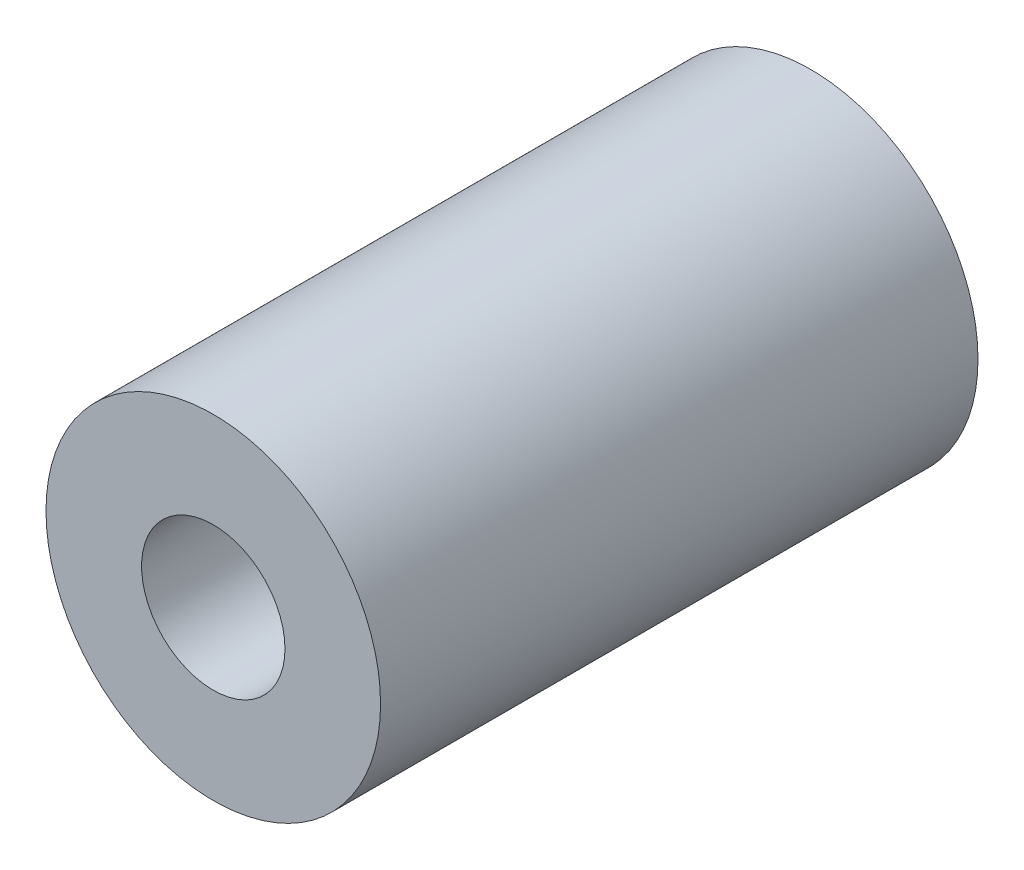
ISO-10303-21;
HEADER;
FILE_DESCRIPTION(('STEP AP214'),'2;1');
FILE_NAME('part.step','',(''),(''),'','','');
FILE_SCHEMA(('AUTOMOTIVE_DESIGN { 1 0 10303 214 1 1 1 1 }'));
ENDSEC;
DATA;
#1=APPLICATION_CONTEXT('core data for automotive mechanical design processes');
#2=APPLICATION_PROTOCOL_DEFINITION('international standard','automotive_design',2000,#1);
#3=PRODUCT_CONTEXT('',#1,'mechanical');
#4=PRODUCT('Part','Part','',(#3));
#5=PRODUCT_RELATED_PRODUCT_CATEGORY('part','',(#4));
#6=PRODUCT_DEFINITION_FORMATION('','',#4);
#7=PRODUCT_DEFINITION_CONTEXT('part definition',#1,'design');
#8=PRODUCT_DEFINITION('design','',#6,#7);
#9=PRODUCT_DEFINITION_SHAPE('','',#8);
#10=(LENGTH_UNIT() NAMED_UNIT(*) SI_UNIT(.MILLI.,.METRE.));
#11=(NAMED_UNIT(*) PLANE_ANGLE_UNIT() SI_UNIT($,.RADIAN.));
#12=(NAMED_UNIT(*) SI_UNIT($,.STERADIAN.) SOLID_ANGLE_UNIT());
#13=UNCERTAINTY_MEASURE_WITH_UNIT(LENGTH_MEASURE(1.E-05),#10,'distance_accuracy_value','');
#14=(GEOMETRIC_REPRESENTATION_CONTEXT(3) GLOBAL_UNCERTAINTY_ASSIGNED_CONTEXT((#13)) GLOBAL_UNIT_ASSIGNED_CONTEXT((#10,
#11,#12)) REPRESENTATION_CONTEXT('',''));
#15=CARTESIAN_POINT('',(0.,0.,0.));
#16=DIRECTION('',(0.,0.,1.));
#17=DIRECTION('',(1.,0.,0.));
#18=AXIS2_PLACEMENT_3D('',#15,#16,#17);
#19=CARTESIAN_POINT('',(0.,0.,25.));
#20=DIRECTION('',(0.,0.,1.));
#21=DIRECTION('',(1.,0.,0.));
#22=AXIS2_PLACEMENT_3D('',#19,#20,#21);
#23=PLANE('',#22);
#24=CARTESIAN_POINT('',(0.,0.,25.));
#25=DIRECTION('',(0.,0.,1.));
#26=DIRECTION('',(1.,0.,0.));
#27=AXIS2_PLACEMENT_3D('',#24,#25,#26);
#28=CIRCLE('',#27,7.);
#29=CARTESIAN_POINT('',(7.,0.,25.));
#30=VERTEX_POINT('',#29);
#31=EDGE_CURVE('E10',#30,#30,#28,.T.);
#32=ORIENTED_EDGE('',*,*,#31,.T.);
#33=EDGE_LOOP('',(#32));
#34=FACE_BOUND('',#33,.T.);
#35=CARTESIAN_POINT('',(0.,0.,25.));
#36=DIRECTION('',(0.,0.,1.));
#37=DIRECTION('',(1.,0.,0.));
#38=AXIS2_PLACEMENT_3D('',#35,#36,#37);
#39=CIRCLE('',#38,3.);
#40=CARTESIAN_POINT('',(3.,0.,25.));
#41=VERTEX_POINT('',#40);
#42=EDGE_CURVE('E48',#41,#41,#39,.T.);
#43=ORIENTED_EDGE('',*,*,#42,.F.);
#44=EDGE_LOOP('',(#43));
#45=FACE_BOUND('',#44,.T.);
#46=ADVANCED_FACE('F37',(#34,#45),#23,.T.);
#47=CARTESIAN_POINT('',(0.,0.,0.));
#48=DIRECTION('',(0.,0.,1.));
#49=DIRECTION('',(1.,0.,0.));
#50=AXIS2_PLACEMENT_3D('',#47,#48,#49);
#51=PLANE('',#50);
#52=CARTESIAN_POINT('',(0.,0.,0.));
#53=DIRECTION('',(0.,0.,1.));
#54=DIRECTION('',(1.,0.,0.));
#55=AXIS2_PLACEMENT_3D('',#52,#53,#54);
#56=CIRCLE('',#55,7.);
#57=CARTESIAN_POINT('',(7.,0.,0.));
#58=VERTEX_POINT('',#57);
#59=EDGE_CURVE('E41',#58,#58,#56,.T.);
#60=ORIENTED_EDGE('',*,*,#59,.F.);
#61=EDGE_LOOP('',(#60));
#62=FACE_BOUND('',#61,.T.);
#63=CARTESIAN_POINT('',(0.,0.,0.));
#64=DIRECTION('',(0.,0.,1.));
#65=DIRECTION('',(1.,0.,0.));
#66=AXIS2_PLACEMENT_3D('',#63,#64,#65);
#67=CIRCLE('',#66,3.);
#68=CARTESIAN_POINT('',(3.,0.,0.));
#69=VERTEX_POINT('',#68);
#70=EDGE_CURVE('E50',#69,#69,#67,.T.);
#71=ORIENTED_EDGE('',*,*,#70,.T.);
#72=EDGE_LOOP('',(#71));
#73=FACE_BOUND('',#72,.T.);
#74=ADVANCED_FACE('F60',(#62,#73),#51,.F.);
#75=CARTESIAN_POINT('',(0.,0.,25.));
#76=DIRECTION('',(0.,0.,-1.));
#77=DIRECTION('',(-1.,0.,0.));
#78=AXIS2_PLACEMENT_3D('',#75,#76,#77);
#79=CYLINDRICAL_SURFACE('',#78,7.);
#80=ORIENTED_EDGE('',*,*,#31,.F.);
#81=EDGE_LOOP('',(#80));
#82=FACE_BOUND('',#81,.T.);
#83=ORIENTED_EDGE('',*,*,#59,.T.);
#84=EDGE_LOOP('',(#83));
#85=FACE_BOUND('',#84,.T.);
#86=ADVANCED_FACE('F39',(#82,#85),#79,.T.);
#87=CARTESIAN_POINT('',(0.,0.,25.));
#88=DIRECTION('',(0.,0.,-1.));
#89=DIRECTION('',(-1.,0.,0.));
#90=AXIS2_PLACEMENT_3D('',#87,#88,#89);
#91=CYLINDRICAL_SURFACE('',#90,3.);
#92=ORIENTED_EDGE('',*,*,#42,.T.);
#93=EDGE_LOOP('',(#92));
#94=FACE_BOUND('',#93,.T.);
#95=ORIENTED_EDGE('',*,*,#70,.F.);
#96=EDGE_LOOP('',(#95));
#97=FACE_BOUND('',#96,.T.);
#98=ADVANCED_FACE('F56',(#94,#97),#91,.F.);
#99=CLOSED_SHELL('',(#46,#74,#86,#98));
#100=MANIFOLD_SOLID_BREP('B2',#99);
#101=ADVANCED_BREP_SHAPE_REPRESENTATION('',(#18,#100),#14);
#102=SHAPE_DEFINITION_REPRESENTATION(#9,#101);
ENDSEC;
END-ISO-10303-21;
